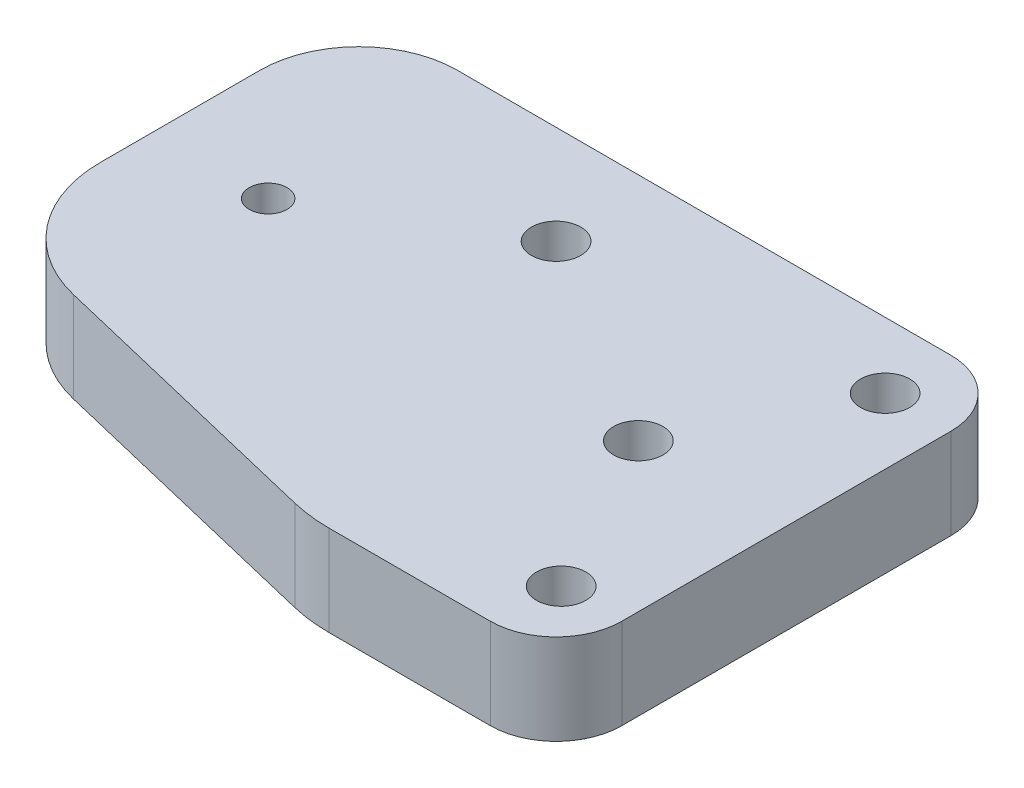
ISO-10303-21;
HEADER;
FILE_DESCRIPTION(('STEP AP214'),'2;1');
FILE_NAME('part.step','',(''),(''),'','','');
FILE_SCHEMA(('AUTOMOTIVE_DESIGN { 1 0 10303 214 1 1 1 1 }'));
ENDSEC;
DATA;
#1=APPLICATION_CONTEXT('core data for automotive mechanical design processes');
#2=APPLICATION_PROTOCOL_DEFINITION('international standard','automotive_design',2000,#1);
#3=PRODUCT_CONTEXT('',#1,'mechanical');
#4=PRODUCT('Part','Part','',(#3));
#5=PRODUCT_RELATED_PRODUCT_CATEGORY('part','',(#4));
#6=PRODUCT_DEFINITION_FORMATION('','',#4);
#7=PRODUCT_DEFINITION_CONTEXT('part definition',#1,'design');
#8=PRODUCT_DEFINITION('design','',#6,#7);
#9=PRODUCT_DEFINITION_SHAPE('','',#8);
#10=(LENGTH_UNIT() NAMED_UNIT(*) SI_UNIT(.MILLI.,.METRE.));
#11=(NAMED_UNIT(*) PLANE_ANGLE_UNIT() SI_UNIT($,.RADIAN.));
#12=(NAMED_UNIT(*) SI_UNIT($,.STERADIAN.) SOLID_ANGLE_UNIT());
#13=UNCERTAINTY_MEASURE_WITH_UNIT(LENGTH_MEASURE(1.E-05),#10,'distance_accuracy_value','');
#14=(GEOMETRIC_REPRESENTATION_CONTEXT(3) GLOBAL_UNCERTAINTY_ASSIGNED_CONTEXT((#13)) GLOBAL_UNIT_ASSIGNED_CONTEXT((#10,
#11,#12)) REPRESENTATION_CONTEXT('',''));
#15=CARTESIAN_POINT('',(0.,0.,0.));
#16=DIRECTION('',(0.,0.,1.));
#17=DIRECTION('',(1.,0.,0.));
#18=AXIS2_PLACEMENT_3D('',#15,#16,#17);
#19=CARTESIAN_POINT('',(0.,5.5,0.));
#20=DIRECTION('',(0.,-1.,0.));
#21=DIRECTION('',(0.,0.,-1.));
#22=AXIS2_PLACEMENT_3D('',#19,#20,#21);
#23=PLANE('',#22);
#24=CARTESIAN_POINT('',(31.,5.5,-24.));
#25=DIRECTION('',(0.,1.,0.));
#26=DIRECTION('',(0.,0.,1.));
#27=AXIS2_PLACEMENT_3D('',#24,#25,#26);
#28=CIRCLE('',#27,1.5);
#29=CARTESIAN_POINT('',(31.,5.5,-22.5));
#30=VERTEX_POINT('',#29);
#31=EDGE_CURVE('E226',#30,#30,#28,.T.);
#32=ORIENTED_EDGE('',*,*,#31,.F.);
#33=EDGE_LOOP('',(#32));
#34=FACE_BOUND('',#33,.T.);
#35=CARTESIAN_POINT('',(36.,5.5,-34.));
#36=DIRECTION('',(0.,1.,0.));
#37=DIRECTION('',(0.,0.,1.));
#38=AXIS2_PLACEMENT_3D('',#35,#36,#37);
#39=CIRCLE('',#38,1.5);
#40=CARTESIAN_POINT('',(36.,5.5,-32.5));
#41=VERTEX_POINT('',#40);
#42=EDGE_CURVE('E215',#41,#41,#39,.T.);
#43=ORIENTED_EDGE('',*,*,#42,.F.);
#44=EDGE_LOOP('',(#43));
#45=FACE_BOUND('',#44,.T.);
#46=DIRECTION('',(0.972387301980517,0.,0.233372952475324));
#47=VECTOR('',#46,1.);
#48=CARTESIAN_POINT('',(0.,5.5,-16.));
#49=LINE('',#48,#47);
#50=CARTESIAN_POINT('',(6.13301638019741,5.5,-14.5280760687526));
#51=VERTEX_POINT('',#50);
#52=CARTESIAN_POINT('',(23.8494709158549,5.5,-10.2761269801948));
#53=VERTEX_POINT('',#52);
#54=EDGE_CURVE('E208',#51,#53,#49,.T.);
#55=ORIENTED_EDGE('',*,*,#54,.T.);
#56=CARTESIAN_POINT('',(26.1832004406081,5.5,-20.));
#57=DIRECTION('',(0.,-1.,0.));
#58=DIRECTION('',(0.,0.,-1.));
#59=AXIS2_PLACEMENT_3D('',#56,#57,#58);
#60=CIRCLE('',#59,10.);
#61=CARTESIAN_POINT('',(26.1832004406081,5.5,-10.));
#62=VERTEX_POINT('',#61);
#63=EDGE_CURVE('E11',#53,#62,#60,.F.);
#64=ORIENTED_EDGE('',*,*,#63,.T.);
#65=DIRECTION('',(1.,0.,0.));
#66=VECTOR('',#65,1.);
#67=CARTESIAN_POINT('',(25.,5.5,-10.));
#68=LINE('',#67,#66);
#69=CARTESIAN_POINT('',(36.,5.5,-10.));
#70=VERTEX_POINT('',#69);
#71=EDGE_CURVE('E129',#62,#70,#68,.T.);
#72=ORIENTED_EDGE('',*,*,#71,.T.);
#73=CARTESIAN_POINT('',(36.,5.5,-14.));
#74=DIRECTION('',(0.,-1.,0.));
#75=DIRECTION('',(0.,0.,-1.));
#76=AXIS2_PLACEMENT_3D('',#73,#74,#75);
#77=CIRCLE('',#76,4.);
#78=CARTESIAN_POINT('',(40.,5.5,-14.));
#79=VERTEX_POINT('',#78);
#80=EDGE_CURVE('E176',#70,#79,#77,.F.);
#81=ORIENTED_EDGE('',*,*,#80,.T.);
#82=DIRECTION('',(0.,0.,-1.));
#83=VECTOR('',#82,1.);
#84=CARTESIAN_POINT('',(40.,5.5,-10.));
#85=LINE('',#84,#83);
#86=CARTESIAN_POINT('',(40.,5.5,-34.));
#87=VERTEX_POINT('',#86);
#88=EDGE_CURVE('E143',#79,#87,#85,.T.);
#89=ORIENTED_EDGE('',*,*,#88,.T.);
#90=CARTESIAN_POINT('',(36.,5.5,-34.));
#91=DIRECTION('',(0.,-1.,0.));
#92=DIRECTION('',(0.,0.,-1.));
#93=AXIS2_PLACEMENT_3D('',#90,#91,#92);
#94=CIRCLE('',#93,4.);
#95=CARTESIAN_POINT('',(36.,5.5,-38.));
#96=VERTEX_POINT('',#95);
#97=EDGE_CURVE('E165',#87,#96,#94,.F.);
#98=ORIENTED_EDGE('',*,*,#97,.T.);
#99=DIRECTION('',(-1.,0.,0.));
#100=VECTOR('',#99,1.);
#101=CARTESIAN_POINT('',(0.,5.5,-38.));
#102=LINE('',#101,#100);
#103=CARTESIAN_POINT('',(6.,5.5,-38.));
#104=VERTEX_POINT('',#103);
#105=EDGE_CURVE('E200',#96,#104,#102,.T.);
#106=ORIENTED_EDGE('',*,*,#105,.T.);
#107=CARTESIAN_POINT('',(6.,5.5,-32.));
#108=DIRECTION('',(0.,-1.,0.));
#109=DIRECTION('',(0.,0.,-1.));
#110=AXIS2_PLACEMENT_3D('',#107,#108,#109);
#111=CIRCLE('',#110,6.);
#112=CARTESIAN_POINT('',(0.,5.5,-32.));
#113=VERTEX_POINT('',#112);
#114=EDGE_CURVE('E146',#104,#113,#111,.F.);
#115=ORIENTED_EDGE('',*,*,#114,.T.);
#116=DIRECTION('',(0.,0.,1.));
#117=VECTOR('',#116,1.);
#118=CARTESIAN_POINT('',(0.,5.5,-16.));
#119=LINE('',#118,#117);
#120=CARTESIAN_POINT('',(0.,5.5,-22.3071744845968));
#121=VERTEX_POINT('',#120);
#122=EDGE_CURVE('E128',#113,#121,#119,.T.);
#123=ORIENTED_EDGE('',*,*,#122,.T.);
#124=CARTESIAN_POINT('',(8.,5.5,-22.3071744845968));
#125=DIRECTION('',(0.,-1.,0.));
#126=DIRECTION('',(0.,0.,-1.));
#127=AXIS2_PLACEMENT_3D('',#124,#125,#126);
#128=CIRCLE('',#127,8.);
#129=EDGE_CURVE('E154',#121,#51,#128,.F.);
#130=ORIENTED_EDGE('',*,*,#129,.T.);
#131=EDGE_LOOP('',(#55,#64,#72,#81,#89,#98,#106,#115,#123,#130));
#132=FACE_BOUND('',#131,.T.);
#133=CARTESIAN_POINT('',(7.,5.5,-25.5));
#134=DIRECTION('',(0.,1.,0.));
#135=DIRECTION('',(0.,0.,1.));
#136=AXIS2_PLACEMENT_3D('',#133,#134,#135);
#137=CIRCLE('',#136,1.15);
#138=CARTESIAN_POINT('',(7.,5.5,-24.35));
#139=VERTEX_POINT('',#138);
#140=EDGE_CURVE('E210',#139,#139,#137,.T.);
#141=ORIENTED_EDGE('',*,*,#140,.F.);
#142=EDGE_LOOP('',(#141));
#143=FACE_BOUND('',#142,.T.);
#144=CARTESIAN_POINT('',(36.3112455848774,5.5,-14.));
#145=DIRECTION('',(0.,1.,0.));
#146=DIRECTION('',(0.,0.,1.));
#147=AXIS2_PLACEMENT_3D('',#144,#145,#146);
#148=CIRCLE('',#147,1.5);
#149=CARTESIAN_POINT('',(36.3112455848774,5.5,-12.5));
#150=VERTEX_POINT('',#149);
#151=EDGE_CURVE('E220',#150,#150,#148,.T.);
#152=ORIENTED_EDGE('',*,*,#151,.F.);
#153=EDGE_LOOP('',(#152));
#154=FACE_BOUND('',#153,.T.);
#155=CARTESIAN_POINT('',(18.,5.5,-32.));
#156=DIRECTION('',(0.,1.,0.));
#157=DIRECTION('',(0.,0.,1.));
#158=AXIS2_PLACEMENT_3D('',#155,#156,#157);
#159=CIRCLE('',#158,1.5);
#160=CARTESIAN_POINT('',(18.,5.5,-30.5));
#161=VERTEX_POINT('',#160);
#162=EDGE_CURVE('E232',#161,#161,#159,.T.);
#163=ORIENTED_EDGE('',*,*,#162,.F.);
#164=EDGE_LOOP('',(#163));
#165=FACE_BOUND('',#164,.T.);
#166=ADVANCED_FACE('F33',(#34,#45,#132,#143,#154,#165),#23,.F.);
#167=CARTESIAN_POINT('',(0.,0.,0.));
#168=DIRECTION('',(0.,-1.,0.));
#169=DIRECTION('',(0.,0.,-1.));
#170=AXIS2_PLACEMENT_3D('',#167,#168,#169);
#171=PLANE('',#170);
#172=CARTESIAN_POINT('',(31.,0.,-24.));
#173=DIRECTION('',(0.,1.,0.));
#174=DIRECTION('',(0.,0.,1.));
#175=AXIS2_PLACEMENT_3D('',#172,#173,#174);
#176=CIRCLE('',#175,1.5);
#177=CARTESIAN_POINT('',(31.,0.,-22.5));
#178=VERTEX_POINT('',#177);
#179=EDGE_CURVE('E229',#178,#178,#176,.T.);
#180=ORIENTED_EDGE('',*,*,#179,.T.);
#181=EDGE_LOOP('',(#180));
#182=FACE_BOUND('',#181,.T.);
#183=CARTESIAN_POINT('',(36.,0.,-34.));
#184=DIRECTION('',(0.,1.,0.));
#185=DIRECTION('',(0.,0.,1.));
#186=AXIS2_PLACEMENT_3D('',#183,#184,#185);
#187=CIRCLE('',#186,1.5);
#188=CARTESIAN_POINT('',(36.,0.,-32.5));
#189=VERTEX_POINT('',#188);
#190=EDGE_CURVE('E217',#189,#189,#187,.T.);
#191=ORIENTED_EDGE('',*,*,#190,.T.);
#192=EDGE_LOOP('',(#191));
#193=FACE_BOUND('',#192,.T.);
#194=DIRECTION('',(1.,0.,0.));
#195=VECTOR('',#194,1.);
#196=CARTESIAN_POINT('',(25.,0.,-10.));
#197=LINE('',#196,#195);
#198=CARTESIAN_POINT('',(26.1832004406081,0.,-10.));
#199=VERTEX_POINT('',#198);
#200=CARTESIAN_POINT('',(36.,0.,-10.));
#201=VERTEX_POINT('',#200);
#202=EDGE_CURVE('E137',#199,#201,#197,.T.);
#203=ORIENTED_EDGE('',*,*,#202,.F.);
#204=CARTESIAN_POINT('',(26.1832004406081,0.,-20.));
#205=DIRECTION('',(0.,-1.,0.));
#206=DIRECTION('',(0.,0.,-1.));
#207=AXIS2_PLACEMENT_3D('',#204,#205,#206);
#208=CIRCLE('',#207,10.);
#209=CARTESIAN_POINT('',(23.8494709158549,0.,-10.2761269801948));
#210=VERTEX_POINT('',#209);
#211=EDGE_CURVE('E55',#199,#210,#208,.T.);
#212=ORIENTED_EDGE('',*,*,#211,.T.);
#213=DIRECTION('',(0.972387301980517,0.,0.233372952475324));
#214=VECTOR('',#213,1.);
#215=CARTESIAN_POINT('',(0.,0.,-16.));
#216=LINE('',#215,#214);
#217=CARTESIAN_POINT('',(6.13301638019741,0.,-14.5280760687526));
#218=VERTEX_POINT('',#217);
#219=EDGE_CURVE('E134',#218,#210,#216,.T.);
#220=ORIENTED_EDGE('',*,*,#219,.F.);
#221=CARTESIAN_POINT('',(8.,0.,-22.3071744845968));
#222=DIRECTION('',(0.,-1.,0.));
#223=DIRECTION('',(0.,0.,-1.));
#224=AXIS2_PLACEMENT_3D('',#221,#222,#223);
#225=CIRCLE('',#224,8.);
#226=CARTESIAN_POINT('',(0.,0.,-22.3071744845968));
#227=VERTEX_POINT('',#226);
#228=EDGE_CURVE('E133',#218,#227,#225,.T.);
#229=ORIENTED_EDGE('',*,*,#228,.T.);
#230=DIRECTION('',(0.,0.,1.));
#231=VECTOR('',#230,1.);
#232=CARTESIAN_POINT('',(0.,0.,-16.));
#233=LINE('',#232,#231);
#234=CARTESIAN_POINT('',(0.,0.,-32.));
#235=VERTEX_POINT('',#234);
#236=EDGE_CURVE('E125',#235,#227,#233,.T.);
#237=ORIENTED_EDGE('',*,*,#236,.F.);
#238=CARTESIAN_POINT('',(6.,0.,-32.));
#239=DIRECTION('',(0.,-1.,0.));
#240=DIRECTION('',(0.,0.,-1.));
#241=AXIS2_PLACEMENT_3D('',#238,#239,#240);
#242=CIRCLE('',#241,6.);
#243=CARTESIAN_POINT('',(6.,0.,-38.));
#244=VERTEX_POINT('',#243);
#245=EDGE_CURVE('E111',#235,#244,#242,.T.);
#246=ORIENTED_EDGE('',*,*,#245,.T.);
#247=DIRECTION('',(-1.,0.,0.));
#248=VECTOR('',#247,1.);
#249=CARTESIAN_POINT('',(0.,0.,-38.));
#250=LINE('',#249,#248);
#251=CARTESIAN_POINT('',(36.,0.,-38.));
#252=VERTEX_POINT('',#251);
#253=EDGE_CURVE('E135',#252,#244,#250,.T.);
#254=ORIENTED_EDGE('',*,*,#253,.F.);
#255=CARTESIAN_POINT('',(36.,0.,-34.));
#256=DIRECTION('',(0.,-1.,0.));
#257=DIRECTION('',(0.,0.,-1.));
#258=AXIS2_PLACEMENT_3D('',#255,#256,#257);
#259=CIRCLE('',#258,4.);
#260=CARTESIAN_POINT('',(40.,0.,-34.));
#261=VERTEX_POINT('',#260);
#262=EDGE_CURVE('E159',#252,#261,#259,.T.);
#263=ORIENTED_EDGE('',*,*,#262,.T.);
#264=DIRECTION('',(0.,0.,-1.));
#265=VECTOR('',#264,1.);
#266=CARTESIAN_POINT('',(40.,0.,-10.));
#267=LINE('',#266,#265);
#268=CARTESIAN_POINT('',(40.,0.,-14.));
#269=VERTEX_POINT('',#268);
#270=EDGE_CURVE('E139',#269,#261,#267,.T.);
#271=ORIENTED_EDGE('',*,*,#270,.F.);
#272=CARTESIAN_POINT('',(36.,0.,-14.));
#273=DIRECTION('',(0.,-1.,0.));
#274=DIRECTION('',(0.,0.,-1.));
#275=AXIS2_PLACEMENT_3D('',#272,#273,#274);
#276=CIRCLE('',#275,4.);
#277=EDGE_CURVE('E170',#269,#201,#276,.T.);
#278=ORIENTED_EDGE('',*,*,#277,.T.);
#279=EDGE_LOOP('',(#203,#212,#220,#229,#237,#246,#254,#263,#271,#278));
#280=FACE_BOUND('',#279,.T.);
#281=CARTESIAN_POINT('',(7.,0.,-25.5));
#282=DIRECTION('',(0.,1.,0.));
#283=DIRECTION('',(0.,0.,1.));
#284=AXIS2_PLACEMENT_3D('',#281,#282,#283);
#285=CIRCLE('',#284,1.15);
#286=CARTESIAN_POINT('',(7.,0.,-24.35));
#287=VERTEX_POINT('',#286);
#288=EDGE_CURVE('E204',#287,#287,#285,.T.);
#289=ORIENTED_EDGE('',*,*,#288,.T.);
#290=EDGE_LOOP('',(#289));
#291=FACE_BOUND('',#290,.T.);
#292=CARTESIAN_POINT('',(36.3112455848774,0.,-14.));
#293=DIRECTION('',(0.,1.,0.));
#294=DIRECTION('',(0.,0.,1.));
#295=AXIS2_PLACEMENT_3D('',#292,#293,#294);
#296=CIRCLE('',#295,1.5);
#297=CARTESIAN_POINT('',(36.3112455848774,0.,-12.5));
#298=VERTEX_POINT('',#297);
#299=EDGE_CURVE('E223',#298,#298,#296,.T.);
#300=ORIENTED_EDGE('',*,*,#299,.T.);
#301=EDGE_LOOP('',(#300));
#302=FACE_BOUND('',#301,.T.);
#303=CARTESIAN_POINT('',(18.,0.,-32.));
#304=DIRECTION('',(0.,1.,0.));
#305=DIRECTION('',(0.,0.,1.));
#306=AXIS2_PLACEMENT_3D('',#303,#304,#305);
#307=CIRCLE('',#306,1.5);
#308=CARTESIAN_POINT('',(18.,0.,-30.5));
#309=VERTEX_POINT('',#308);
#310=EDGE_CURVE('E235',#309,#309,#307,.T.);
#311=ORIENTED_EDGE('',*,*,#310,.T.);
#312=EDGE_LOOP('',(#311));
#313=FACE_BOUND('',#312,.T.);
#314=ADVANCED_FACE('F131',(#182,#193,#280,#291,#302,#313),#171,.T.);
#315=CARTESIAN_POINT('',(40.,5.5,-10.));
#316=DIRECTION('',(-1.,0.,0.));
#317=DIRECTION('',(0.,0.,1.));
#318=AXIS2_PLACEMENT_3D('',#315,#316,#317);
#319=PLANE('',#318);
#320=ORIENTED_EDGE('',*,*,#88,.F.);
#321=DIRECTION('',(0.,-1.,0.));
#322=VECTOR('',#321,1.);
#323=CARTESIAN_POINT('',(40.,5.5,-14.));
#324=LINE('',#323,#322);
#325=EDGE_CURVE('E167',#79,#269,#324,.T.);
#326=ORIENTED_EDGE('',*,*,#325,.T.);
#327=ORIENTED_EDGE('',*,*,#270,.T.);
#328=DIRECTION('',(0.,-1.,0.));
#329=VECTOR('',#328,1.);
#330=CARTESIAN_POINT('',(40.,5.5,-34.));
#331=LINE('',#330,#329);
#332=EDGE_CURVE('E162',#261,#87,#331,.F.);
#333=ORIENTED_EDGE('',*,*,#332,.T.);
#334=EDGE_LOOP('',(#320,#326,#327,#333));
#335=FACE_BOUND('',#334,.T.);
#336=ADVANCED_FACE('F197',(#335),#319,.F.);
#337=CARTESIAN_POINT('',(0.,5.5,-38.));
#338=DIRECTION('',(0.,0.,1.));
#339=DIRECTION('',(1.,0.,0.));
#340=AXIS2_PLACEMENT_3D('',#337,#338,#339);
#341=PLANE('',#340);
#342=ORIENTED_EDGE('',*,*,#105,.F.);
#343=DIRECTION('',(0.,-1.,0.));
#344=VECTOR('',#343,1.);
#345=CARTESIAN_POINT('',(36.,5.5,-38.));
#346=LINE('',#345,#344);
#347=EDGE_CURVE('E156',#96,#252,#346,.T.);
#348=ORIENTED_EDGE('',*,*,#347,.T.);
#349=ORIENTED_EDGE('',*,*,#253,.T.);
#350=DIRECTION('',(0.,-1.,0.));
#351=VECTOR('',#350,1.);
#352=CARTESIAN_POINT('',(6.,5.5,-38.));
#353=LINE('',#352,#351);
#354=EDGE_CURVE('E117',#244,#104,#353,.F.);
#355=ORIENTED_EDGE('',*,*,#354,.T.);
#356=EDGE_LOOP('',(#342,#348,#349,#355));
#357=FACE_BOUND('',#356,.T.);
#358=ADVANCED_FACE('F265',(#357),#341,.F.);
#359=CARTESIAN_POINT('',(0.,5.5,-16.));
#360=DIRECTION('',(1.,0.,0.));
#361=DIRECTION('',(0.,0.,-1.));
#362=AXIS2_PLACEMENT_3D('',#359,#360,#361);
#363=PLANE('',#362);
#364=ORIENTED_EDGE('',*,*,#236,.T.);
#365=DIRECTION('',(0.,-1.,0.));
#366=VECTOR('',#365,1.);
#367=CARTESIAN_POINT('',(0.,5.5,-22.3071744845968));
#368=LINE('',#367,#366);
#369=EDGE_CURVE('E152',#227,#121,#368,.F.);
#370=ORIENTED_EDGE('',*,*,#369,.T.);
#371=ORIENTED_EDGE('',*,*,#122,.F.);
#372=DIRECTION('',(0.,-1.,0.));
#373=VECTOR('',#372,1.);
#374=CARTESIAN_POINT('',(0.,5.5,-32.));
#375=LINE('',#374,#373);
#376=EDGE_CURVE('E115',#113,#235,#375,.T.);
#377=ORIENTED_EDGE('',*,*,#376,.T.);
#378=EDGE_LOOP('',(#364,#370,#371,#377));
#379=FACE_BOUND('',#378,.T.);
#380=ADVANCED_FACE('F124',(#379),#363,.F.);
#381=CARTESIAN_POINT('',(0.,5.5,-16.));
#382=DIRECTION('',(0.233372952475324,0.,-0.972387301980517));
#383=DIRECTION('',(-0.972387301980517,0.,-0.233372952475324));
#384=AXIS2_PLACEMENT_3D('',#381,#382,#383);
#385=PLANE('',#384);
#386=ORIENTED_EDGE('',*,*,#219,.T.);
#387=DIRECTION('',(0.,-1.,0.));
#388=VECTOR('',#387,1.);
#389=CARTESIAN_POINT('',(23.8494709158549,5.5,-10.2761269801948));
#390=LINE('',#389,#388);
#391=EDGE_CURVE('E41',#210,#53,#390,.F.);
#392=ORIENTED_EDGE('',*,*,#391,.T.);
#393=ORIENTED_EDGE('',*,*,#54,.F.);
#394=DIRECTION('',(0.,-1.,0.));
#395=VECTOR('',#394,1.);
#396=CARTESIAN_POINT('',(6.13301638019741,5.5,-14.5280760687526));
#397=LINE('',#396,#395);
#398=EDGE_CURVE('E148',#51,#218,#397,.T.);
#399=ORIENTED_EDGE('',*,*,#398,.T.);
#400=EDGE_LOOP('',(#386,#392,#393,#399));
#401=FACE_BOUND('',#400,.T.);
#402=ADVANCED_FACE('F260',(#401),#385,.F.);
#403=CARTESIAN_POINT('',(25.,5.5,-10.));
#404=DIRECTION('',(0.,0.,-1.));
#405=DIRECTION('',(-1.,0.,0.));
#406=AXIS2_PLACEMENT_3D('',#403,#404,#405);
#407=PLANE('',#406);
#408=ORIENTED_EDGE('',*,*,#71,.F.);
#409=DIRECTION('',(0.,-1.,0.));
#410=VECTOR('',#409,1.);
#411=CARTESIAN_POINT('',(26.1832004406081,5.5,-10.));
#412=LINE('',#411,#410);
#413=EDGE_CURVE('E178',#62,#199,#412,.T.);
#414=ORIENTED_EDGE('',*,*,#413,.T.);
#415=ORIENTED_EDGE('',*,*,#202,.T.);
#416=DIRECTION('',(0.,-1.,0.));
#417=VECTOR('',#416,1.);
#418=CARTESIAN_POINT('',(36.,5.5,-10.));
#419=LINE('',#418,#417);
#420=EDGE_CURVE('E173',#201,#70,#419,.F.);
#421=ORIENTED_EDGE('',*,*,#420,.T.);
#422=EDGE_LOOP('',(#408,#414,#415,#421));
#423=FACE_BOUND('',#422,.T.);
#424=ADVANCED_FACE('F184',(#423),#407,.F.);
#425=CARTESIAN_POINT('',(7.,5.5,-25.5));
#426=DIRECTION('',(0.,-1.,0.));
#427=DIRECTION('',(0.,0.,-1.));
#428=AXIS2_PLACEMENT_3D('',#425,#426,#427);
#429=CYLINDRICAL_SURFACE('',#428,1.15);
#430=ORIENTED_EDGE('',*,*,#140,.T.);
#431=EDGE_LOOP('',(#430));
#432=FACE_BOUND('',#431,.T.);
#433=ORIENTED_EDGE('',*,*,#288,.F.);
#434=EDGE_LOOP('',(#433));
#435=FACE_BOUND('',#434,.T.);
#436=ADVANCED_FACE('F255',(#432,#435),#429,.F.);
#437=CARTESIAN_POINT('',(36.,5.5,-34.));
#438=DIRECTION('',(0.,-1.,0.));
#439=DIRECTION('',(0.,0.,-1.));
#440=AXIS2_PLACEMENT_3D('',#437,#438,#439);
#441=CYLINDRICAL_SURFACE('',#440,1.5);
#442=ORIENTED_EDGE('',*,*,#42,.T.);
#443=EDGE_LOOP('',(#442));
#444=FACE_BOUND('',#443,.T.);
#445=ORIENTED_EDGE('',*,*,#190,.F.);
#446=EDGE_LOOP('',(#445));
#447=FACE_BOUND('',#446,.T.);
#448=ADVANCED_FACE('F382',(#444,#447),#441,.F.);
#449=CARTESIAN_POINT('',(36.3112455848774,5.5,-14.));
#450=DIRECTION('',(0.,-1.,0.));
#451=DIRECTION('',(0.,0.,-1.));
#452=AXIS2_PLACEMENT_3D('',#449,#450,#451);
#453=CYLINDRICAL_SURFACE('',#452,1.5);
#454=ORIENTED_EDGE('',*,*,#151,.T.);
#455=EDGE_LOOP('',(#454));
#456=FACE_BOUND('',#455,.T.);
#457=ORIENTED_EDGE('',*,*,#299,.F.);
#458=EDGE_LOOP('',(#457));
#459=FACE_BOUND('',#458,.T.);
#460=ADVANCED_FACE('F372',(#456,#459),#453,.F.);
#461=CARTESIAN_POINT('',(31.,5.5,-24.));
#462=DIRECTION('',(0.,-1.,0.));
#463=DIRECTION('',(0.,0.,-1.));
#464=AXIS2_PLACEMENT_3D('',#461,#462,#463);
#465=CYLINDRICAL_SURFACE('',#464,1.5);
#466=ORIENTED_EDGE('',*,*,#31,.T.);
#467=EDGE_LOOP('',(#466));
#468=FACE_BOUND('',#467,.T.);
#469=ORIENTED_EDGE('',*,*,#179,.F.);
#470=EDGE_LOOP('',(#469));
#471=FACE_BOUND('',#470,.T.);
#472=ADVANCED_FACE('F363',(#468,#471),#465,.F.);
#473=CARTESIAN_POINT('',(18.,5.5,-32.));
#474=DIRECTION('',(0.,-1.,0.));
#475=DIRECTION('',(0.,0.,-1.));
#476=AXIS2_PLACEMENT_3D('',#473,#474,#475);
#477=CYLINDRICAL_SURFACE('',#476,1.5);
#478=ORIENTED_EDGE('',*,*,#162,.T.);
#479=EDGE_LOOP('',(#478));
#480=FACE_BOUND('',#479,.T.);
#481=ORIENTED_EDGE('',*,*,#310,.F.);
#482=EDGE_LOOP('',(#481));
#483=FACE_BOUND('',#482,.T.);
#484=ADVANCED_FACE('F241',(#480,#483),#477,.F.);
#485=CARTESIAN_POINT('',(6.,5.5,-32.));
#486=DIRECTION('',(0.,-1.,0.));
#487=DIRECTION('',(0.,0.,-1.));
#488=AXIS2_PLACEMENT_3D('',#485,#486,#487);
#489=CYLINDRICAL_SURFACE('',#488,6.);
#490=ORIENTED_EDGE('',*,*,#114,.F.);
#491=ORIENTED_EDGE('',*,*,#354,.F.);
#492=ORIENTED_EDGE('',*,*,#245,.F.);
#493=ORIENTED_EDGE('',*,*,#376,.F.);
#494=EDGE_LOOP('',(#490,#491,#492,#493));
#495=FACE_BOUND('',#494,.T.);
#496=ADVANCED_FACE('F114',(#495),#489,.T.);
#497=CARTESIAN_POINT('',(8.,5.5,-22.3071744845968));
#498=DIRECTION('',(0.,-1.,0.));
#499=DIRECTION('',(0.,0.,-1.));
#500=AXIS2_PLACEMENT_3D('',#497,#498,#499);
#501=CYLINDRICAL_SURFACE('',#500,8.);
#502=ORIENTED_EDGE('',*,*,#129,.F.);
#503=ORIENTED_EDGE('',*,*,#369,.F.);
#504=ORIENTED_EDGE('',*,*,#228,.F.);
#505=ORIENTED_EDGE('',*,*,#398,.F.);
#506=EDGE_LOOP('',(#502,#503,#504,#505));
#507=FACE_BOUND('',#506,.T.);
#508=ADVANCED_FACE('F273',(#507),#501,.T.);
#509=CARTESIAN_POINT('',(36.,5.5,-34.));
#510=DIRECTION('',(0.,-1.,0.));
#511=DIRECTION('',(0.,0.,-1.));
#512=AXIS2_PLACEMENT_3D('',#509,#510,#511);
#513=CYLINDRICAL_SURFACE('',#512,4.);
#514=ORIENTED_EDGE('',*,*,#97,.F.);
#515=ORIENTED_EDGE('',*,*,#332,.F.);
#516=ORIENTED_EDGE('',*,*,#262,.F.);
#517=ORIENTED_EDGE('',*,*,#347,.F.);
#518=EDGE_LOOP('',(#514,#515,#516,#517));
#519=FACE_BOUND('',#518,.T.);
#520=ADVANCED_FACE('F276',(#519),#513,.T.);
#521=CARTESIAN_POINT('',(36.,5.5,-14.));
#522=DIRECTION('',(0.,-1.,0.));
#523=DIRECTION('',(0.,0.,-1.));
#524=AXIS2_PLACEMENT_3D('',#521,#522,#523);
#525=CYLINDRICAL_SURFACE('',#524,4.);
#526=ORIENTED_EDGE('',*,*,#80,.F.);
#527=ORIENTED_EDGE('',*,*,#420,.F.);
#528=ORIENTED_EDGE('',*,*,#277,.F.);
#529=ORIENTED_EDGE('',*,*,#325,.F.);
#530=EDGE_LOOP('',(#526,#527,#528,#529));
#531=FACE_BOUND('',#530,.T.);
#532=ADVANCED_FACE('F192',(#531),#525,.T.);
#533=CARTESIAN_POINT('',(26.1832004406081,5.5,-20.));
#534=DIRECTION('',(0.,-1.,0.));
#535=DIRECTION('',(0.,0.,-1.));
#536=AXIS2_PLACEMENT_3D('',#533,#534,#535);
#537=CYLINDRICAL_SURFACE('',#536,10.);
#538=ORIENTED_EDGE('',*,*,#63,.F.);
#539=ORIENTED_EDGE('',*,*,#391,.F.);
#540=ORIENTED_EDGE('',*,*,#211,.F.);
#541=ORIENTED_EDGE('',*,*,#413,.F.);
#542=EDGE_LOOP('',(#538,#539,#540,#541));
#543=FACE_BOUND('',#542,.T.);
#544=ADVANCED_FACE('F35',(#543),#537,.T.);
#545=CLOSED_SHELL('',(#166,#314,#336,#358,#380,#402,#424,#436,#448,#460,#472,#484,#496,#508,
#520,#532,#544));
#546=MANIFOLD_SOLID_BREP('B2',#545);
#547=ADVANCED_BREP_SHAPE_REPRESENTATION('',(#18,#546),#14);
#548=SHAPE_DEFINITION_REPRESENTATION(#9,#547);
ENDSEC;
END-ISO-10303-21;
